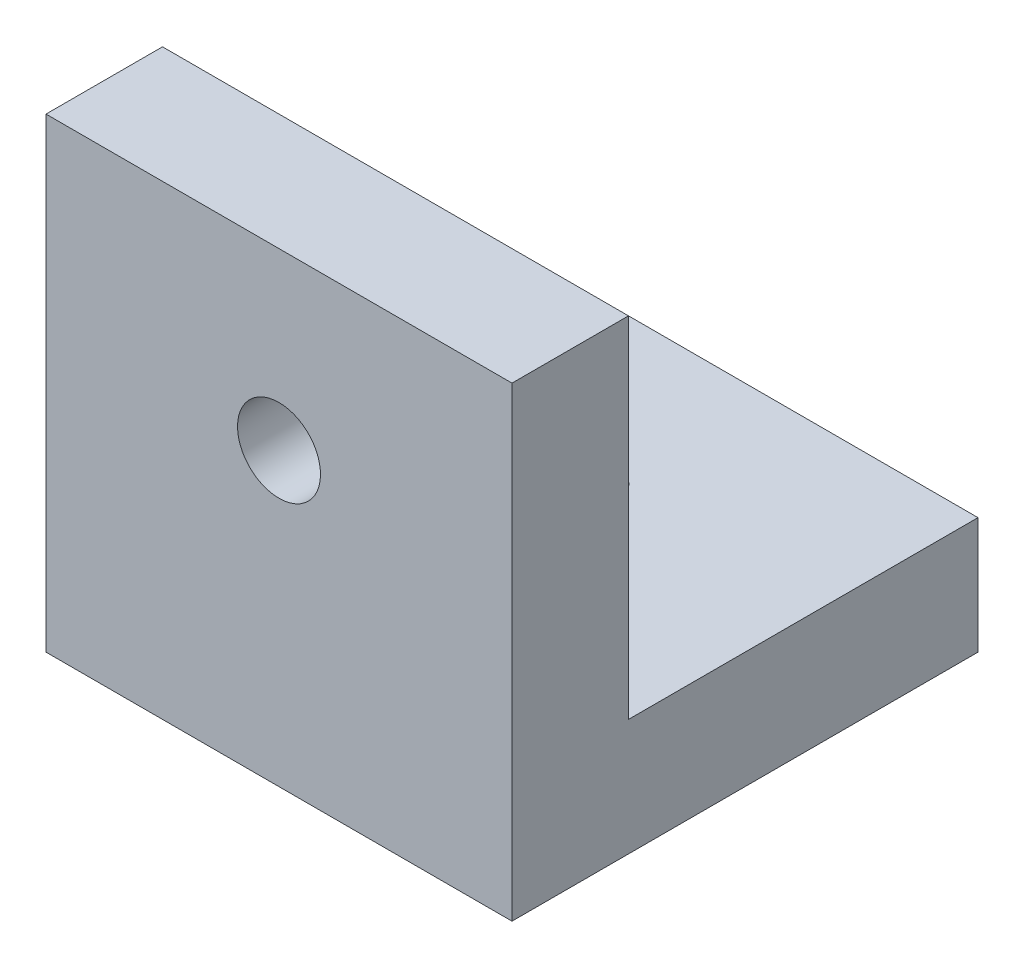
ISO-10303-21;
HEADER;
FILE_DESCRIPTION(('STEP AP214'),'2;1');
FILE_NAME('part.step','',(''),(''),'','','');
FILE_SCHEMA(('AUTOMOTIVE_DESIGN { 1 0 10303 214 1 1 1 1 }'));
ENDSEC;
DATA;
#1=APPLICATION_CONTEXT('core data for automotive mechanical design processes');
#2=APPLICATION_PROTOCOL_DEFINITION('international standard','automotive_design',2000,#1);
#3=PRODUCT_CONTEXT('',#1,'mechanical');
#4=PRODUCT('Part','Part','',(#3));
#5=PRODUCT_RELATED_PRODUCT_CATEGORY('part','',(#4));
#6=PRODUCT_DEFINITION_FORMATION('','',#4);
#7=PRODUCT_DEFINITION_CONTEXT('part definition',#1,'design');
#8=PRODUCT_DEFINITION('design','',#6,#7);
#9=PRODUCT_DEFINITION_SHAPE('','',#8);
#10=(LENGTH_UNIT() NAMED_UNIT(*) SI_UNIT(.MILLI.,.METRE.));
#11=(NAMED_UNIT(*) PLANE_ANGLE_UNIT() SI_UNIT($,.RADIAN.));
#12=(NAMED_UNIT(*) SI_UNIT($,.STERADIAN.) SOLID_ANGLE_UNIT());
#13=UNCERTAINTY_MEASURE_WITH_UNIT(LENGTH_MEASURE(1.E-05),#10,'distance_accuracy_value','');
#14=(GEOMETRIC_REPRESENTATION_CONTEXT(3) GLOBAL_UNCERTAINTY_ASSIGNED_CONTEXT((#13)) GLOBAL_UNIT_ASSIGNED_CONTEXT((#10,
#11,#12)) REPRESENTATION_CONTEXT('',''));
#15=CARTESIAN_POINT('',(0.,0.,0.));
#16=DIRECTION('',(0.,0.,1.));
#17=DIRECTION('',(1.,0.,0.));
#18=AXIS2_PLACEMENT_3D('',#15,#16,#17);
#19=CARTESIAN_POINT('',(12.7,0.,-12.7));
#20=DIRECTION('',(0.,1.,0.));
#21=DIRECTION('',(0.,0.,1.));
#22=AXIS2_PLACEMENT_3D('',#19,#20,#21);
#23=PLANE('',#22);
#24=CARTESIAN_POINT('',(6.35,0.,-7.9375));
#25=DIRECTION('',(0.,1.,0.));
#26=DIRECTION('',(0.,0.,1.));
#27=AXIS2_PLACEMENT_3D('',#24,#25,#26);
#28=CIRCLE('',#27,1.13029999999999);
#29=CARTESIAN_POINT('',(6.35,0.,-6.80720000000001));
#30=VERTEX_POINT('',#29);
#31=EDGE_CURVE('E163',#30,#30,#28,.T.);
#32=ORIENTED_EDGE('',*,*,#31,.T.);
#33=EDGE_LOOP('',(#32));
#34=FACE_BOUND('',#33,.T.);
#35=DIRECTION('',(0.,0.,-1.));
#36=VECTOR('',#35,1.);
#37=CARTESIAN_POINT('',(0.,0.,-12.7));
#38=LINE('',#37,#36);
#39=CARTESIAN_POINT('',(0.,0.,0.));
#40=VERTEX_POINT('',#39);
#41=CARTESIAN_POINT('',(0.,0.,-12.7));
#42=VERTEX_POINT('',#41);
#43=EDGE_CURVE('E119',#40,#42,#38,.T.);
#44=ORIENTED_EDGE('',*,*,#43,.T.);
#45=DIRECTION('',(-1.,0.,0.));
#46=VECTOR('',#45,1.);
#47=CARTESIAN_POINT('',(12.7,0.,-12.7));
#48=LINE('',#47,#46);
#49=CARTESIAN_POINT('',(12.7,0.,-12.7));
#50=VERTEX_POINT('',#49);
#51=EDGE_CURVE('E11',#50,#42,#48,.T.);
#52=ORIENTED_EDGE('',*,*,#51,.F.);
#53=DIRECTION('',(0.,0.,-1.));
#54=VECTOR('',#53,1.);
#55=CARTESIAN_POINT('',(12.7,0.,-12.7));
#56=LINE('',#55,#54);
#57=CARTESIAN_POINT('',(12.7,0.,0.));
#58=VERTEX_POINT('',#57);
#59=EDGE_CURVE('E130',#58,#50,#56,.T.);
#60=ORIENTED_EDGE('',*,*,#59,.F.);
#61=DIRECTION('',(-1.,0.,0.));
#62=VECTOR('',#61,1.);
#63=CARTESIAN_POINT('',(12.7,0.,0.));
#64=LINE('',#63,#62);
#65=EDGE_CURVE('E115',#58,#40,#64,.T.);
#66=ORIENTED_EDGE('',*,*,#65,.T.);
#67=EDGE_LOOP('',(#44,#52,#60,#66));
#68=FACE_BOUND('',#67,.T.);
#69=ADVANCED_FACE('F35',(#34,#68),#23,.F.);
#70=CARTESIAN_POINT('',(12.7,3.175,-12.7));
#71=DIRECTION('',(0.,0.,1.));
#72=DIRECTION('',(1.,0.,0.));
#73=AXIS2_PLACEMENT_3D('',#70,#71,#72);
#74=PLANE('',#73);
#75=DIRECTION('',(0.,1.,0.));
#76=VECTOR('',#75,1.);
#77=CARTESIAN_POINT('',(0.,3.175,-12.7));
#78=LINE('',#77,#76);
#79=CARTESIAN_POINT('',(0.,3.175,-12.7));
#80=VERTEX_POINT('',#79);
#81=EDGE_CURVE('E122',#42,#80,#78,.T.);
#82=ORIENTED_EDGE('',*,*,#81,.T.);
#83=DIRECTION('',(-1.,0.,0.));
#84=VECTOR('',#83,1.);
#85=CARTESIAN_POINT('',(12.7,3.175,-12.7));
#86=LINE('',#85,#84);
#87=CARTESIAN_POINT('',(12.7,3.175,-12.7));
#88=VERTEX_POINT('',#87);
#89=EDGE_CURVE('E43',#88,#80,#86,.T.);
#90=ORIENTED_EDGE('',*,*,#89,.F.);
#91=DIRECTION('',(0.,1.,0.));
#92=VECTOR('',#91,1.);
#93=CARTESIAN_POINT('',(12.7,3.175,-12.7));
#94=LINE('',#93,#92);
#95=EDGE_CURVE('E88',#50,#88,#94,.T.);
#96=ORIENTED_EDGE('',*,*,#95,.F.);
#97=ORIENTED_EDGE('',*,*,#51,.T.);
#98=EDGE_LOOP('',(#82,#90,#96,#97));
#99=FACE_BOUND('',#98,.T.);
#100=ADVANCED_FACE('F156',(#99),#74,.F.);
#101=CARTESIAN_POINT('',(12.7,3.175,-3.175));
#102=DIRECTION('',(0.,-1.,0.));
#103=DIRECTION('',(0.,0.,-1.));
#104=AXIS2_PLACEMENT_3D('',#101,#102,#103);
#105=PLANE('',#104);
#106=CARTESIAN_POINT('',(6.35,3.175,-7.9375));
#107=DIRECTION('',(0.,1.,0.));
#108=DIRECTION('',(0.,0.,1.));
#109=AXIS2_PLACEMENT_3D('',#106,#107,#108);
#110=CIRCLE('',#109,1.13029999999999);
#111=CARTESIAN_POINT('',(6.35,3.175,-6.80720000000001));
#112=VERTEX_POINT('',#111);
#113=EDGE_CURVE('E166',#112,#112,#110,.T.);
#114=ORIENTED_EDGE('',*,*,#113,.F.);
#115=EDGE_LOOP('',(#114));
#116=FACE_BOUND('',#115,.T.);
#117=DIRECTION('',(0.,0.,1.));
#118=VECTOR('',#117,1.);
#119=CARTESIAN_POINT('',(0.,3.175,-3.175));
#120=LINE('',#119,#118);
#121=CARTESIAN_POINT('',(0.,3.175,-3.175));
#122=VERTEX_POINT('',#121);
#123=EDGE_CURVE('E125',#80,#122,#120,.T.);
#124=ORIENTED_EDGE('',*,*,#123,.T.);
#125=DIRECTION('',(-1.,0.,0.));
#126=VECTOR('',#125,1.);
#127=CARTESIAN_POINT('',(12.7,3.175,-3.175));
#128=LINE('',#127,#126);
#129=CARTESIAN_POINT('',(12.7,3.175,-3.175));
#130=VERTEX_POINT('',#129);
#131=EDGE_CURVE('E110',#130,#122,#128,.T.);
#132=ORIENTED_EDGE('',*,*,#131,.F.);
#133=DIRECTION('',(0.,0.,1.));
#134=VECTOR('',#133,1.);
#135=CARTESIAN_POINT('',(12.7,3.175,-3.175));
#136=LINE('',#135,#134);
#137=EDGE_CURVE('E101',#88,#130,#136,.T.);
#138=ORIENTED_EDGE('',*,*,#137,.F.);
#139=ORIENTED_EDGE('',*,*,#89,.T.);
#140=EDGE_LOOP('',(#124,#132,#138,#139));
#141=FACE_BOUND('',#140,.T.);
#142=ADVANCED_FACE('F136',(#116,#141),#105,.F.);
#143=CARTESIAN_POINT('',(12.7,12.7,-3.175));
#144=DIRECTION('',(0.,0.,1.));
#145=DIRECTION('',(0.,-1.,0.));
#146=AXIS2_PLACEMENT_3D('',#143,#144,#145);
#147=PLANE('',#146);
#148=CARTESIAN_POINT('',(6.35,7.9375,-3.175));
#149=DIRECTION('',(0.,0.,-1.));
#150=DIRECTION('',(0.,1.,0.));
#151=AXIS2_PLACEMENT_3D('',#148,#149,#150);
#152=CIRCLE('',#151,1.13029999999999);
#153=CARTESIAN_POINT('',(6.35,9.06779999999999,-3.175));
#154=VERTEX_POINT('',#153);
#155=EDGE_CURVE('E165',#154,#154,#152,.T.);
#156=ORIENTED_EDGE('',*,*,#155,.F.);
#157=EDGE_LOOP('',(#156));
#158=FACE_BOUND('',#157,.T.);
#159=DIRECTION('',(0.,1.,0.));
#160=VECTOR('',#159,1.);
#161=CARTESIAN_POINT('',(0.,12.7,-3.175));
#162=LINE('',#161,#160);
#163=CARTESIAN_POINT('',(0.,12.7,-3.175));
#164=VERTEX_POINT('',#163);
#165=EDGE_CURVE('E109',#122,#164,#162,.T.);
#166=ORIENTED_EDGE('',*,*,#165,.T.);
#167=DIRECTION('',(-1.,0.,0.));
#168=VECTOR('',#167,1.);
#169=CARTESIAN_POINT('',(12.7,12.7,-3.175));
#170=LINE('',#169,#168);
#171=CARTESIAN_POINT('',(12.7,12.7,-3.175));
#172=VERTEX_POINT('',#171);
#173=EDGE_CURVE('E106',#172,#164,#170,.T.);
#174=ORIENTED_EDGE('',*,*,#173,.F.);
#175=DIRECTION('',(0.,1.,0.));
#176=VECTOR('',#175,1.);
#177=CARTESIAN_POINT('',(12.7,12.7,-3.175));
#178=LINE('',#177,#176);
#179=EDGE_CURVE('E95',#130,#172,#178,.T.);
#180=ORIENTED_EDGE('',*,*,#179,.F.);
#181=ORIENTED_EDGE('',*,*,#131,.T.);
#182=EDGE_LOOP('',(#166,#174,#180,#181));
#183=FACE_BOUND('',#182,.T.);
#184=ADVANCED_FACE('F107',(#158,#183),#147,.F.);
#185=CARTESIAN_POINT('',(12.7,12.7,0.));
#186=DIRECTION('',(0.,-1.,0.));
#187=DIRECTION('',(0.,0.,-1.));
#188=AXIS2_PLACEMENT_3D('',#185,#186,#187);
#189=PLANE('',#188);
#190=DIRECTION('',(0.,0.,1.));
#191=VECTOR('',#190,1.);
#192=CARTESIAN_POINT('',(0.,12.7,0.));
#193=LINE('',#192,#191);
#194=CARTESIAN_POINT('',(0.,12.7,0.));
#195=VERTEX_POINT('',#194);
#196=EDGE_CURVE('E74',#164,#195,#193,.T.);
#197=ORIENTED_EDGE('',*,*,#196,.T.);
#198=DIRECTION('',(-1.,0.,0.));
#199=VECTOR('',#198,1.);
#200=CARTESIAN_POINT('',(12.7,12.7,0.));
#201=LINE('',#200,#199);
#202=CARTESIAN_POINT('',(12.7,12.7,0.));
#203=VERTEX_POINT('',#202);
#204=EDGE_CURVE('E111',#203,#195,#201,.T.);
#205=ORIENTED_EDGE('',*,*,#204,.F.);
#206=DIRECTION('',(0.,0.,1.));
#207=VECTOR('',#206,1.);
#208=CARTESIAN_POINT('',(12.7,12.7,0.));
#209=LINE('',#208,#207);
#210=EDGE_CURVE('E99',#172,#203,#209,.T.);
#211=ORIENTED_EDGE('',*,*,#210,.F.);
#212=ORIENTED_EDGE('',*,*,#173,.T.);
#213=EDGE_LOOP('',(#197,#205,#211,#212));
#214=FACE_BOUND('',#213,.T.);
#215=ADVANCED_FACE('F113',(#214),#189,.F.);
#216=CARTESIAN_POINT('',(12.7,0.,0.));
#217=DIRECTION('',(0.,0.,-1.));
#218=DIRECTION('',(-1.,0.,0.));
#219=AXIS2_PLACEMENT_3D('',#216,#217,#218);
#220=PLANE('',#219);
#221=CARTESIAN_POINT('',(6.35,7.9375,0.));
#222=DIRECTION('',(0.,0.,-1.));
#223=DIRECTION('',(-1.,0.,0.));
#224=AXIS2_PLACEMENT_3D('',#221,#222,#223);
#225=CIRCLE('',#224,1.13029999999999);
#226=CARTESIAN_POINT('',(5.21970000000001,7.9375,0.));
#227=VERTEX_POINT('',#226);
#228=EDGE_CURVE('E123',#227,#227,#225,.T.);
#229=ORIENTED_EDGE('',*,*,#228,.T.);
#230=EDGE_LOOP('',(#229));
#231=FACE_BOUND('',#230,.T.);
#232=DIRECTION('',(0.,-1.,0.));
#233=VECTOR('',#232,1.);
#234=CARTESIAN_POINT('',(0.,0.,0.));
#235=LINE('',#234,#233);
#236=EDGE_CURVE('E80',#195,#40,#235,.T.);
#237=ORIENTED_EDGE('',*,*,#236,.T.);
#238=ORIENTED_EDGE('',*,*,#65,.F.);
#239=DIRECTION('',(0.,-1.,0.));
#240=VECTOR('',#239,1.);
#241=CARTESIAN_POINT('',(12.7,0.,0.));
#242=LINE('',#241,#240);
#243=EDGE_CURVE('E51',#203,#58,#242,.T.);
#244=ORIENTED_EDGE('',*,*,#243,.F.);
#245=ORIENTED_EDGE('',*,*,#204,.T.);
#246=EDGE_LOOP('',(#237,#238,#244,#245));
#247=FACE_BOUND('',#246,.T.);
#248=ADVANCED_FACE('F143',(#231,#247),#220,.F.);
#249=CARTESIAN_POINT('',(12.7,0.,0.));
#250=DIRECTION('',(-1.,0.,0.));
#251=DIRECTION('',(0.,0.,1.));
#252=AXIS2_PLACEMENT_3D('',#249,#250,#251);
#253=PLANE('',#252);
#254=ORIENTED_EDGE('',*,*,#59,.T.);
#255=ORIENTED_EDGE('',*,*,#95,.T.);
#256=ORIENTED_EDGE('',*,*,#137,.T.);
#257=ORIENTED_EDGE('',*,*,#179,.T.);
#258=ORIENTED_EDGE('',*,*,#210,.T.);
#259=ORIENTED_EDGE('',*,*,#243,.T.);
#260=EDGE_LOOP('',(#254,#255,#256,#257,#258,#259));
#261=FACE_BOUND('',#260,.T.);
#262=ADVANCED_FACE('F97',(#261),#253,.F.);
#263=CARTESIAN_POINT('',(0.,0.,0.));
#264=DIRECTION('',(-1.,0.,0.));
#265=DIRECTION('',(0.,0.,1.));
#266=AXIS2_PLACEMENT_3D('',#263,#264,#265);
#267=PLANE('',#266);
#268=ORIENTED_EDGE('',*,*,#43,.F.);
#269=ORIENTED_EDGE('',*,*,#236,.F.);
#270=ORIENTED_EDGE('',*,*,#196,.F.);
#271=ORIENTED_EDGE('',*,*,#165,.F.);
#272=ORIENTED_EDGE('',*,*,#123,.F.);
#273=ORIENTED_EDGE('',*,*,#81,.F.);
#274=EDGE_LOOP('',(#268,#269,#270,#271,#272,#273));
#275=FACE_BOUND('',#274,.T.);
#276=ADVANCED_FACE('F139',(#275),#267,.T.);
#277=CARTESIAN_POINT('',(6.35,7.9375,-3.175));
#278=DIRECTION('',(0.,0.,-1.));
#279=DIRECTION('',(0.,1.,0.));
#280=AXIS2_PLACEMENT_3D('',#277,#278,#279);
#281=CYLINDRICAL_SURFACE('',#280,1.13029999999999);
#282=ORIENTED_EDGE('',*,*,#155,.T.);
#283=EDGE_LOOP('',(#282));
#284=FACE_BOUND('',#283,.T.);
#285=ORIENTED_EDGE('',*,*,#228,.F.);
#286=EDGE_LOOP('',(#285));
#287=FACE_BOUND('',#286,.T.);
#288=ADVANCED_FACE('F177',(#284,#287),#281,.F.);
#289=CARTESIAN_POINT('',(6.35,3.175,-7.9375));
#290=DIRECTION('',(0.,1.,0.));
#291=DIRECTION('',(0.,0.,1.));
#292=AXIS2_PLACEMENT_3D('',#289,#290,#291);
#293=CYLINDRICAL_SURFACE('',#292,1.13029999999999);
#294=ORIENTED_EDGE('',*,*,#113,.T.);
#295=EDGE_LOOP('',(#294));
#296=FACE_BOUND('',#295,.T.);
#297=ORIENTED_EDGE('',*,*,#31,.F.);
#298=EDGE_LOOP('',(#297));
#299=FACE_BOUND('',#298,.T.);
#300=ADVANCED_FACE('F179',(#296,#299),#293,.F.);
#301=CLOSED_SHELL('',(#69,#100,#142,#184,#215,#248,#262,#276,#288,#300));
#302=MANIFOLD_SOLID_BREP('B2',#301);
#303=ADVANCED_BREP_SHAPE_REPRESENTATION('',(#18,#302),#14);
#304=SHAPE_DEFINITION_REPRESENTATION(#9,#303);
ENDSEC;
END-ISO-10303-21;
